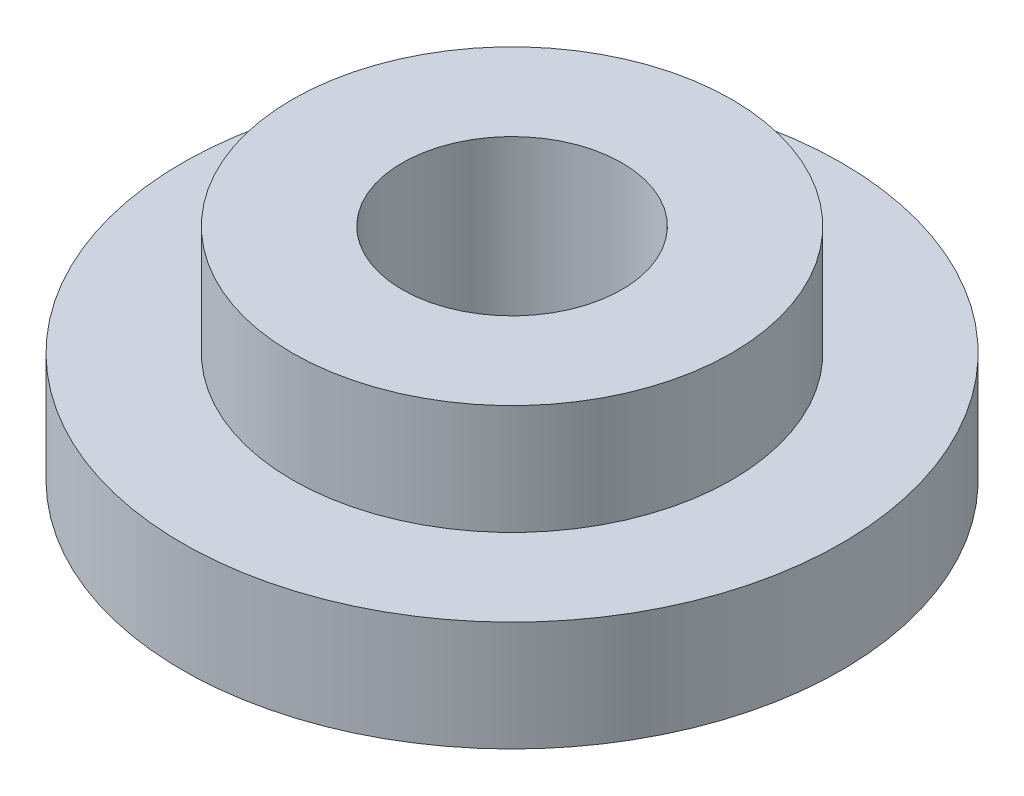
ISO-10303-21;
HEADER;
FILE_DESCRIPTION(('STEP AP214'),'2;1');
FILE_NAME('part.step','',(''),(''),'','','');
FILE_SCHEMA(('AUTOMOTIVE_DESIGN { 1 0 10303 214 1 1 1 1 }'));
ENDSEC;
DATA;
#1=APPLICATION_CONTEXT('core data for automotive mechanical design processes');
#2=APPLICATION_PROTOCOL_DEFINITION('international standard','automotive_design',2000,#1);
#3=PRODUCT_CONTEXT('',#1,'mechanical');
#4=PRODUCT('Part','Part','',(#3));
#5=PRODUCT_RELATED_PRODUCT_CATEGORY('part','',(#4));
#6=PRODUCT_DEFINITION_FORMATION('','',#4);
#7=PRODUCT_DEFINITION_CONTEXT('part definition',#1,'design');
#8=PRODUCT_DEFINITION('design','',#6,#7);
#9=PRODUCT_DEFINITION_SHAPE('','',#8);
#10=(LENGTH_UNIT() NAMED_UNIT(*) SI_UNIT(.MILLI.,.METRE.));
#11=(NAMED_UNIT(*) PLANE_ANGLE_UNIT() SI_UNIT($,.RADIAN.));
#12=(NAMED_UNIT(*) SI_UNIT($,.STERADIAN.) SOLID_ANGLE_UNIT());
#13=UNCERTAINTY_MEASURE_WITH_UNIT(LENGTH_MEASURE(1.E-05),#10,'distance_accuracy_value','');
#14=(GEOMETRIC_REPRESENTATION_CONTEXT(3) GLOBAL_UNCERTAINTY_ASSIGNED_CONTEXT((#13)) GLOBAL_UNIT_ASSIGNED_CONTEXT((#10,
#11,#12)) REPRESENTATION_CONTEXT('',''));
#15=CARTESIAN_POINT('',(0.,0.,0.));
#16=DIRECTION('',(0.,0.,1.));
#17=DIRECTION('',(1.,0.,0.));
#18=AXIS2_PLACEMENT_3D('',#15,#16,#17);
#19=CARTESIAN_POINT('',(-4.,4.,0.));
#20=DIRECTION('',(0.,-1.,0.));
#21=DIRECTION('',(0.,0.,-1.));
#22=AXIS2_PLACEMENT_3D('',#19,#20,#21);
#23=PLANE('',#22);
#24=CARTESIAN_POINT('',(0.,4.,0.));
#25=DIRECTION('',(0.,-1.,0.));
#26=DIRECTION('',(0.,0.,-1.));
#27=AXIS2_PLACEMENT_3D('',#24,#25,#26);
#28=CIRCLE('',#27,4.);
#29=CARTESIAN_POINT('',(0.,4.,-4.));
#30=VERTEX_POINT('',#29);
#31=EDGE_CURVE('E54',#30,#30,#28,.T.);
#32=ORIENTED_EDGE('',*,*,#31,.F.);
#33=EDGE_LOOP('',(#32));
#34=FACE_BOUND('',#33,.T.);
#35=CARTESIAN_POINT('',(0.,4.,0.));
#36=DIRECTION('',(0.,-1.,0.));
#37=DIRECTION('',(0.,0.,-1.));
#38=AXIS2_PLACEMENT_3D('',#35,#36,#37);
#39=CIRCLE('',#38,2.);
#40=CARTESIAN_POINT('',(0.,4.,-2.));
#41=VERTEX_POINT('',#40);
#42=EDGE_CURVE('E10',#41,#41,#39,.T.);
#43=ORIENTED_EDGE('',*,*,#42,.T.);
#44=EDGE_LOOP('',(#43));
#45=FACE_BOUND('',#44,.T.);
#46=ADVANCED_FACE('F32',(#34,#45),#23,.F.);
#47=CARTESIAN_POINT('',(0.,0.,0.));
#48=DIRECTION('',(0.,-1.,0.));
#49=DIRECTION('',(0.,0.,-1.));
#50=AXIS2_PLACEMENT_3D('',#47,#48,#49);
#51=CYLINDRICAL_SURFACE('',#50,2.);
#52=ORIENTED_EDGE('',*,*,#42,.F.);
#53=EDGE_LOOP('',(#52));
#54=FACE_BOUND('',#53,.T.);
#55=CARTESIAN_POINT('',(0.,0.,0.));
#56=DIRECTION('',(0.,-1.,0.));
#57=DIRECTION('',(0.,0.,-1.));
#58=AXIS2_PLACEMENT_3D('',#55,#56,#57);
#59=CIRCLE('',#58,2.);
#60=CARTESIAN_POINT('',(0.,0.,-2.));
#61=VERTEX_POINT('',#60);
#62=EDGE_CURVE('E38',#61,#61,#59,.T.);
#63=ORIENTED_EDGE('',*,*,#62,.T.);
#64=EDGE_LOOP('',(#63));
#65=FACE_BOUND('',#64,.T.);
#66=ADVANCED_FACE('F61',(#54,#65),#51,.F.);
#67=CARTESIAN_POINT('',(-2.,0.,0.));
#68=DIRECTION('',(0.,1.,0.));
#69=DIRECTION('',(0.,0.,1.));
#70=AXIS2_PLACEMENT_3D('',#67,#68,#69);
#71=PLANE('',#70);
#72=ORIENTED_EDGE('',*,*,#62,.F.);
#73=EDGE_LOOP('',(#72));
#74=FACE_BOUND('',#73,.T.);
#75=CARTESIAN_POINT('',(0.,0.,0.));
#76=DIRECTION('',(0.,-1.,0.));
#77=DIRECTION('',(0.,0.,-1.));
#78=AXIS2_PLACEMENT_3D('',#75,#76,#77);
#79=CIRCLE('',#78,6.);
#80=CARTESIAN_POINT('',(0.,0.,-6.));
#81=VERTEX_POINT('',#80);
#82=EDGE_CURVE('E42',#81,#81,#79,.T.);
#83=ORIENTED_EDGE('',*,*,#82,.T.);
#84=EDGE_LOOP('',(#83));
#85=FACE_BOUND('',#84,.T.);
#86=ADVANCED_FACE('F65',(#74,#85),#71,.F.);
#87=CARTESIAN_POINT('',(0.,0.,0.));
#88=DIRECTION('',(0.,-1.,0.));
#89=DIRECTION('',(0.,0.,-1.));
#90=AXIS2_PLACEMENT_3D('',#87,#88,#89);
#91=CYLINDRICAL_SURFACE('',#90,6.);
#92=ORIENTED_EDGE('',*,*,#82,.F.);
#93=EDGE_LOOP('',(#92));
#94=FACE_BOUND('',#93,.T.);
#95=CARTESIAN_POINT('',(0.,2.,0.));
#96=DIRECTION('',(0.,-1.,0.));
#97=DIRECTION('',(0.,0.,-1.));
#98=AXIS2_PLACEMENT_3D('',#95,#96,#97);
#99=CIRCLE('',#98,6.);
#100=CARTESIAN_POINT('',(0.,2.,-6.));
#101=VERTEX_POINT('',#100);
#102=EDGE_CURVE('E46',#101,#101,#99,.T.);
#103=ORIENTED_EDGE('',*,*,#102,.T.);
#104=EDGE_LOOP('',(#103));
#105=FACE_BOUND('',#104,.T.);
#106=ADVANCED_FACE('F70',(#94,#105),#91,.T.);
#107=CARTESIAN_POINT('',(-6.,2.,0.));
#108=DIRECTION('',(0.,-1.,0.));
#109=DIRECTION('',(0.,0.,-1.));
#110=AXIS2_PLACEMENT_3D('',#107,#108,#109);
#111=PLANE('',#110);
#112=ORIENTED_EDGE('',*,*,#102,.F.);
#113=EDGE_LOOP('',(#112));
#114=FACE_BOUND('',#113,.T.);
#115=CARTESIAN_POINT('',(0.,1.99999999999999,0.));
#116=DIRECTION('',(0.,-1.,0.));
#117=DIRECTION('',(0.,0.,-1.));
#118=AXIS2_PLACEMENT_3D('',#115,#116,#117);
#119=CIRCLE('',#118,4.);
#120=CARTESIAN_POINT('',(0.,1.99999999999999,-4.));
#121=VERTEX_POINT('',#120);
#122=EDGE_CURVE('E51',#121,#121,#119,.T.);
#123=ORIENTED_EDGE('',*,*,#122,.T.);
#124=EDGE_LOOP('',(#123));
#125=FACE_BOUND('',#124,.T.);
#126=ADVANCED_FACE('F76',(#114,#125),#111,.F.);
#127=CARTESIAN_POINT('',(0.,0.,0.));
#128=DIRECTION('',(0.,-1.,0.));
#129=DIRECTION('',(0.,0.,-1.));
#130=AXIS2_PLACEMENT_3D('',#127,#128,#129);
#131=CYLINDRICAL_SURFACE('',#130,4.);
#132=ORIENTED_EDGE('',*,*,#122,.F.);
#133=EDGE_LOOP('',(#132));
#134=FACE_BOUND('',#133,.T.);
#135=ORIENTED_EDGE('',*,*,#31,.T.);
#136=EDGE_LOOP('',(#135));
#137=FACE_BOUND('',#136,.T.);
#138=ADVANCED_FACE('F58',(#134,#137),#131,.T.);
#139=CLOSED_SHELL('',(#46,#66,#86,#106,#126,#138));
#140=MANIFOLD_SOLID_BREP('B2',#139);
#141=ADVANCED_BREP_SHAPE_REPRESENTATION('',(#18,#140),#14);
#142=SHAPE_DEFINITION_REPRESENTATION(#9,#141);
ENDSEC;
END-ISO-10303-21;
